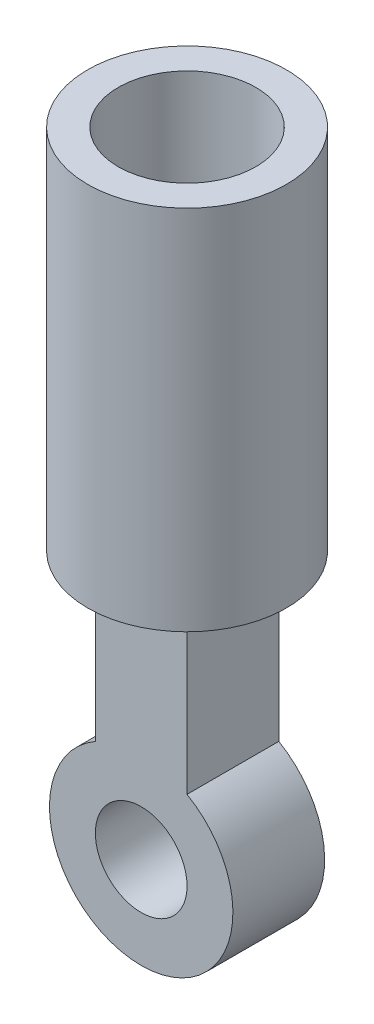
ISO-10303-21;
HEADER;
FILE_DESCRIPTION(('STEP AP214'),'2;1');
FILE_NAME('part.step','',(''),(''),'','','');
FILE_SCHEMA(('AUTOMOTIVE_DESIGN { 1 0 10303 214 1 1 1 1 }'));
ENDSEC;
DATA;
#1=APPLICATION_CONTEXT('core data for automotive mechanical design processes');
#2=APPLICATION_PROTOCOL_DEFINITION('international standard','automotive_design',2000,#1);
#3=PRODUCT_CONTEXT('',#1,'mechanical');
#4=PRODUCT('Part','Part','',(#3));
#5=PRODUCT_RELATED_PRODUCT_CATEGORY('part','',(#4));
#6=PRODUCT_DEFINITION_FORMATION('','',#4);
#7=PRODUCT_DEFINITION_CONTEXT('part definition',#1,'design');
#8=PRODUCT_DEFINITION('design','',#6,#7);
#9=PRODUCT_DEFINITION_SHAPE('','',#8);
#10=(LENGTH_UNIT() NAMED_UNIT(*) SI_UNIT(.MILLI.,.METRE.));
#11=(NAMED_UNIT(*) PLANE_ANGLE_UNIT() SI_UNIT($,.RADIAN.));
#12=(NAMED_UNIT(*) SI_UNIT($,.STERADIAN.) SOLID_ANGLE_UNIT());
#13=UNCERTAINTY_MEASURE_WITH_UNIT(LENGTH_MEASURE(1.E-05),#10,'distance_accuracy_value','');
#14=(GEOMETRIC_REPRESENTATION_CONTEXT(3) GLOBAL_UNCERTAINTY_ASSIGNED_CONTEXT((#13)) GLOBAL_UNIT_ASSIGNED_CONTEXT((#10,
#11,#12)) REPRESENTATION_CONTEXT('',''));
#15=CARTESIAN_POINT('',(0.,0.,0.));
#16=DIRECTION('',(0.,0.,1.));
#17=DIRECTION('',(1.,0.,0.));
#18=AXIS2_PLACEMENT_3D('',#15,#16,#17);
#19=CARTESIAN_POINT('',(0.,0.,3.));
#20=DIRECTION('',(0.,0.,1.));
#21=DIRECTION('',(1.,0.,0.));
#22=AXIS2_PLACEMENT_3D('',#19,#20,#21);
#23=PLANE('',#22);
#24=CARTESIAN_POINT('',(0.,0.,3.));
#25=DIRECTION('',(0.,0.,1.));
#26=DIRECTION('',(1.,0.,0.));
#27=AXIS2_PLACEMENT_3D('',#24,#25,#26);
#28=CIRCLE('',#27,1.5);
#29=CARTESIAN_POINT('',(1.5,0.,3.));
#30=VERTEX_POINT('',#29);
#31=EDGE_CURVE('E152',#30,#30,#28,.T.);
#32=ORIENTED_EDGE('',*,*,#31,.F.);
#33=EDGE_LOOP('',(#32));
#34=FACE_BOUND('',#33,.T.);
#35=DIRECTION('',(0.,1.,0.));
#36=VECTOR('',#35,1.);
#37=CARTESIAN_POINT('',(1.5,10.,3.));
#38=LINE('',#37,#36);
#39=CARTESIAN_POINT('',(1.5,2.59807621135332,3.));
#40=VERTEX_POINT('',#39);
#41=CARTESIAN_POINT('',(1.5,8.,3.));
#42=VERTEX_POINT('',#41);
#43=EDGE_CURVE('E158',#40,#42,#38,.T.);
#44=ORIENTED_EDGE('',*,*,#43,.T.);
#45=DIRECTION('',(-1.,0.,0.));
#46=VECTOR('',#45,1.);
#47=CARTESIAN_POINT('',(0.,8.,3.));
#48=LINE('',#47,#46);
#49=CARTESIAN_POINT('',(-1.5,8.,3.));
#50=VERTEX_POINT('',#49);
#51=EDGE_CURVE('E147',#42,#50,#48,.T.);
#52=ORIENTED_EDGE('',*,*,#51,.T.);
#53=DIRECTION('',(0.,-1.,0.));
#54=VECTOR('',#53,1.);
#55=CARTESIAN_POINT('',(-1.5,10.,3.));
#56=LINE('',#55,#54);
#57=CARTESIAN_POINT('',(-1.5,2.59807621135332,3.));
#58=VERTEX_POINT('',#57);
#59=EDGE_CURVE('E160',#50,#58,#56,.T.);
#60=ORIENTED_EDGE('',*,*,#59,.T.);
#61=CARTESIAN_POINT('',(0.,0.,3.));
#62=DIRECTION('',(0.,0.,1.));
#63=DIRECTION('',(1.,0.,0.));
#64=AXIS2_PLACEMENT_3D('',#61,#62,#63);
#65=CIRCLE('',#64,3.);
#66=EDGE_CURVE('E163',#58,#40,#65,.T.);
#67=ORIENTED_EDGE('',*,*,#66,.T.);
#68=EDGE_LOOP('',(#44,#52,#60,#67));
#69=FACE_BOUND('',#68,.T.);
#70=ADVANCED_FACE('F33',(#34,#69),#23,.T.);
#71=CARTESIAN_POINT('',(0.,0.,0.));
#72=DIRECTION('',(0.,0.,1.));
#73=DIRECTION('',(1.,0.,0.));
#74=AXIS2_PLACEMENT_3D('',#71,#72,#73);
#75=PLANE('',#74);
#76=CARTESIAN_POINT('',(0.,0.,0.));
#77=DIRECTION('',(0.,0.,1.));
#78=DIRECTION('',(1.,0.,0.));
#79=AXIS2_PLACEMENT_3D('',#76,#77,#78);
#80=CIRCLE('',#79,1.5);
#81=CARTESIAN_POINT('',(1.5,0.,0.));
#82=VERTEX_POINT('',#81);
#83=EDGE_CURVE('E151',#82,#82,#80,.T.);
#84=ORIENTED_EDGE('',*,*,#83,.T.);
#85=EDGE_LOOP('',(#84));
#86=FACE_BOUND('',#85,.T.);
#87=DIRECTION('',(-1.,0.,0.));
#88=VECTOR('',#87,1.);
#89=CARTESIAN_POINT('',(0.,8.,0.));
#90=LINE('',#89,#88);
#91=CARTESIAN_POINT('',(1.5,8.,0.));
#92=VERTEX_POINT('',#91);
#93=CARTESIAN_POINT('',(-1.5,8.,0.));
#94=VERTEX_POINT('',#93);
#95=EDGE_CURVE('E56',#92,#94,#90,.T.);
#96=ORIENTED_EDGE('',*,*,#95,.F.);
#97=DIRECTION('',(0.,1.,0.));
#98=VECTOR('',#97,1.);
#99=CARTESIAN_POINT('',(1.5,10.,0.));
#100=LINE('',#99,#98);
#101=CARTESIAN_POINT('',(1.5,2.59807621135332,0.));
#102=VERTEX_POINT('',#101);
#103=EDGE_CURVE('E155',#102,#92,#100,.T.);
#104=ORIENTED_EDGE('',*,*,#103,.F.);
#105=CARTESIAN_POINT('',(0.,0.,0.));
#106=DIRECTION('',(0.,0.,1.));
#107=DIRECTION('',(1.,0.,0.));
#108=AXIS2_PLACEMENT_3D('',#105,#106,#107);
#109=CIRCLE('',#108,3.);
#110=CARTESIAN_POINT('',(-1.5,2.59807621135332,0.));
#111=VERTEX_POINT('',#110);
#112=EDGE_CURVE('E161',#111,#102,#109,.T.);
#113=ORIENTED_EDGE('',*,*,#112,.F.);
#114=DIRECTION('',(0.,-1.,0.));
#115=VECTOR('',#114,1.);
#116=CARTESIAN_POINT('',(-1.5,10.,0.));
#117=LINE('',#116,#115);
#118=EDGE_CURVE('E167',#94,#111,#117,.T.);
#119=ORIENTED_EDGE('',*,*,#118,.F.);
#120=EDGE_LOOP('',(#96,#104,#113,#119));
#121=FACE_BOUND('',#120,.T.);
#122=ADVANCED_FACE('F179',(#86,#121),#75,.F.);
#123=CARTESIAN_POINT('',(1.5,10.,3.));
#124=DIRECTION('',(-1.,0.,0.));
#125=DIRECTION('',(0.,-1.,0.));
#126=AXIS2_PLACEMENT_3D('',#123,#124,#125);
#127=PLANE('',#126);
#128=DIRECTION('',(0.,0.,-1.));
#129=VECTOR('',#128,1.);
#130=CARTESIAN_POINT('',(1.5,8.,3.));
#131=LINE('',#130,#129);
#132=EDGE_CURVE('E48',#42,#92,#131,.T.);
#133=ORIENTED_EDGE('',*,*,#132,.F.);
#134=ORIENTED_EDGE('',*,*,#43,.F.);
#135=DIRECTION('',(0.,0.,-1.));
#136=VECTOR('',#135,1.);
#137=CARTESIAN_POINT('',(1.5,2.59807621135332,3.));
#138=LINE('',#137,#136);
#139=EDGE_CURVE('E165',#40,#102,#138,.T.);
#140=ORIENTED_EDGE('',*,*,#139,.T.);
#141=ORIENTED_EDGE('',*,*,#103,.T.);
#142=EDGE_LOOP('',(#133,#134,#140,#141));
#143=FACE_BOUND('',#142,.T.);
#144=ADVANCED_FACE('F35',(#143),#127,.F.);
#145=CARTESIAN_POINT('',(-1.5,10.,3.));
#146=DIRECTION('',(1.,0.,0.));
#147=DIRECTION('',(0.,1.,0.));
#148=AXIS2_PLACEMENT_3D('',#145,#146,#147);
#149=PLANE('',#148);
#150=DIRECTION('',(0.,0.,1.));
#151=VECTOR('',#150,1.);
#152=CARTESIAN_POINT('',(-1.5,8.,3.));
#153=LINE('',#152,#151);
#154=EDGE_CURVE('E11',#94,#50,#153,.T.);
#155=ORIENTED_EDGE('',*,*,#154,.F.);
#156=ORIENTED_EDGE('',*,*,#118,.T.);
#157=DIRECTION('',(0.,0.,-1.));
#158=VECTOR('',#157,1.);
#159=CARTESIAN_POINT('',(-1.5,2.59807621135332,3.));
#160=LINE('',#159,#158);
#161=EDGE_CURVE('E41',#58,#111,#160,.T.);
#162=ORIENTED_EDGE('',*,*,#161,.F.);
#163=ORIENTED_EDGE('',*,*,#59,.F.);
#164=EDGE_LOOP('',(#155,#156,#162,#163));
#165=FACE_BOUND('',#164,.T.);
#166=ADVANCED_FACE('F184',(#165),#149,.F.);
#167=CARTESIAN_POINT('',(0.,0.,3.));
#168=DIRECTION('',(0.,0.,-1.));
#169=DIRECTION('',(-1.,0.,0.));
#170=AXIS2_PLACEMENT_3D('',#167,#168,#169);
#171=CYLINDRICAL_SURFACE('',#170,3.);
#172=ORIENTED_EDGE('',*,*,#112,.T.);
#173=ORIENTED_EDGE('',*,*,#139,.F.);
#174=ORIENTED_EDGE('',*,*,#66,.F.);
#175=ORIENTED_EDGE('',*,*,#161,.T.);
#176=EDGE_LOOP('',(#172,#173,#174,#175));
#177=FACE_BOUND('',#176,.T.);
#178=ADVANCED_FACE('F176',(#177),#171,.T.);
#179=CARTESIAN_POINT('',(0.,0.,3.));
#180=DIRECTION('',(0.,0.,-1.));
#181=DIRECTION('',(-1.,0.,0.));
#182=AXIS2_PLACEMENT_3D('',#179,#180,#181);
#183=CYLINDRICAL_SURFACE('',#182,1.5);
#184=ORIENTED_EDGE('',*,*,#31,.T.);
#185=EDGE_LOOP('',(#184));
#186=FACE_BOUND('',#185,.T.);
#187=ORIENTED_EDGE('',*,*,#83,.F.);
#188=EDGE_LOOP('',(#187));
#189=FACE_BOUND('',#188,.T.);
#190=ADVANCED_FACE('F190',(#186,#189),#183,.F.);
#191=CARTESIAN_POINT('',(0.,8.,1.5));
#192=DIRECTION('',(0.,1.,0.));
#193=DIRECTION('',(0.,0.,1.));
#194=AXIS2_PLACEMENT_3D('',#191,#192,#193);
#195=PLANE('',#194);
#196=CARTESIAN_POINT('',(0.,8.,1.5));
#197=DIRECTION('',(0.,1.,0.));
#198=DIRECTION('',(0.,0.,1.));
#199=AXIS2_PLACEMENT_3D('',#196,#197,#198);
#200=CIRCLE('',#199,3.25);
#201=CARTESIAN_POINT('',(0.,8.,4.75));
#202=VERTEX_POINT('',#201);
#203=EDGE_CURVE('E143',#202,#202,#200,.T.);
#204=ORIENTED_EDGE('',*,*,#203,.F.);
#205=EDGE_LOOP('',(#204));
#206=FACE_BOUND('',#205,.T.);
#207=ORIENTED_EDGE('',*,*,#51,.F.);
#208=ORIENTED_EDGE('',*,*,#132,.T.);
#209=ORIENTED_EDGE('',*,*,#95,.T.);
#210=ORIENTED_EDGE('',*,*,#154,.T.);
#211=EDGE_LOOP('',(#207,#208,#209,#210));
#212=FACE_BOUND('',#211,.T.);
#213=ADVANCED_FACE('F182',(#206,#212),#195,.F.);
#214=CARTESIAN_POINT('',(0.,8.,1.5));
#215=DIRECTION('',(0.,1.,0.));
#216=DIRECTION('',(0.,0.,1.));
#217=AXIS2_PLACEMENT_3D('',#214,#215,#216);
#218=CYLINDRICAL_SURFACE('',#217,3.25);
#219=ORIENTED_EDGE('',*,*,#203,.T.);
#220=EDGE_LOOP('',(#219));
#221=FACE_BOUND('',#220,.T.);
#222=CARTESIAN_POINT('',(0.,20.,1.5));
#223=DIRECTION('',(0.,1.,0.));
#224=DIRECTION('',(0.,0.,1.));
#225=AXIS2_PLACEMENT_3D('',#222,#223,#224);
#226=CIRCLE('',#225,3.25);
#227=CARTESIAN_POINT('',(0.,20.,4.75));
#228=VERTEX_POINT('',#227);
#229=EDGE_CURVE('E140',#228,#228,#226,.T.);
#230=ORIENTED_EDGE('',*,*,#229,.F.);
#231=EDGE_LOOP('',(#230));
#232=FACE_BOUND('',#231,.T.);
#233=ADVANCED_FACE('F205',(#221,#232),#218,.T.);
#234=CARTESIAN_POINT('',(0.,20.,1.5));
#235=DIRECTION('',(0.,1.,0.));
#236=DIRECTION('',(0.,0.,1.));
#237=AXIS2_PLACEMENT_3D('',#234,#235,#236);
#238=PLANE('',#237);
#239=CARTESIAN_POINT('',(0.,20.,1.5));
#240=DIRECTION('',(0.,1.,0.));
#241=DIRECTION('',(0.,0.,1.));
#242=AXIS2_PLACEMENT_3D('',#239,#240,#241);
#243=CIRCLE('',#242,2.25);
#244=CARTESIAN_POINT('',(0.,20.,3.75));
#245=VERTEX_POINT('',#244);
#246=EDGE_CURVE('E136',#245,#245,#243,.T.);
#247=ORIENTED_EDGE('',*,*,#246,.F.);
#248=EDGE_LOOP('',(#247));
#249=FACE_BOUND('',#248,.T.);
#250=ORIENTED_EDGE('',*,*,#229,.T.);
#251=EDGE_LOOP('',(#250));
#252=FACE_BOUND('',#251,.T.);
#253=ADVANCED_FACE('F208',(#249,#252),#238,.T.);
#254=CARTESIAN_POINT('',(0.,0.,2.));
#255=DIRECTION('',(0.,0.,1.));
#256=DIRECTION('',(1.,0.,0.));
#257=AXIS2_PLACEMENT_3D('',#254,#255,#256);
#258=PLANE('',#257);
#259=CARTESIAN_POINT('',(0.,0.,2.));
#260=DIRECTION('',(0.,0.,1.));
#261=DIRECTION('',(1.,0.,0.));
#262=AXIS2_PLACEMENT_3D('',#259,#260,#261);
#263=CIRCLE('',#262,2.5);
#264=CARTESIAN_POINT('',(0.499999999999999,2.44948974278318,2.));
#265=VERTEX_POINT('',#264);
#266=CARTESIAN_POINT('',(-0.499999999999999,2.44948974278318,2.));
#267=VERTEX_POINT('',#266);
#268=EDGE_CURVE('E108',#265,#267,#263,.T.);
#269=ORIENTED_EDGE('',*,*,#268,.T.);
#270=DIRECTION('',(0.,-1.,0.));
#271=VECTOR('',#270,1.);
#272=CARTESIAN_POINT('',(-0.5,10.,2.));
#273=LINE('',#272,#271);
#274=CARTESIAN_POINT('',(-0.5,9.,2.));
#275=VERTEX_POINT('',#274);
#276=EDGE_CURVE('E102',#275,#267,#273,.T.);
#277=ORIENTED_EDGE('',*,*,#276,.F.);
#278=DIRECTION('',(-1.,0.,0.));
#279=VECTOR('',#278,1.);
#280=CARTESIAN_POINT('',(0.,9.,2.));
#281=LINE('',#280,#279);
#282=CARTESIAN_POINT('',(0.5,9.,2.));
#283=VERTEX_POINT('',#282);
#284=EDGE_CURVE('E106',#283,#275,#281,.T.);
#285=ORIENTED_EDGE('',*,*,#284,.F.);
#286=DIRECTION('',(0.,1.,0.));
#287=VECTOR('',#286,1.);
#288=CARTESIAN_POINT('',(0.5,10.,2.));
#289=LINE('',#288,#287);
#290=EDGE_CURVE('E112',#265,#283,#289,.T.);
#291=ORIENTED_EDGE('',*,*,#290,.F.);
#292=EDGE_LOOP('',(#269,#277,#285,#291));
#293=FACE_BOUND('',#292,.T.);
#294=ADVANCED_FACE('F104',(#293),#258,.F.);
#295=CARTESIAN_POINT('',(0.,0.,1.));
#296=DIRECTION('',(0.,0.,1.));
#297=DIRECTION('',(1.,0.,0.));
#298=AXIS2_PLACEMENT_3D('',#295,#296,#297);
#299=PLANE('',#298);
#300=DIRECTION('',(0.,1.,0.));
#301=VECTOR('',#300,1.);
#302=CARTESIAN_POINT('',(0.5,10.,1.));
#303=LINE('',#302,#301);
#304=CARTESIAN_POINT('',(0.499999999999999,2.44948974278318,1.));
#305=VERTEX_POINT('',#304);
#306=CARTESIAN_POINT('',(0.5,9.,1.));
#307=VERTEX_POINT('',#306);
#308=EDGE_CURVE('E333',#305,#307,#303,.T.);
#309=ORIENTED_EDGE('',*,*,#308,.T.);
#310=DIRECTION('',(-1.,0.,0.));
#311=VECTOR('',#310,1.);
#312=CARTESIAN_POINT('',(0.,9.,1.));
#313=LINE('',#312,#311);
#314=CARTESIAN_POINT('',(-0.5,9.,1.));
#315=VERTEX_POINT('',#314);
#316=EDGE_CURVE('E121',#307,#315,#313,.T.);
#317=ORIENTED_EDGE('',*,*,#316,.T.);
#318=DIRECTION('',(0.,-1.,0.));
#319=VECTOR('',#318,1.);
#320=CARTESIAN_POINT('',(-0.5,10.,1.));
#321=LINE('',#320,#319);
#322=CARTESIAN_POINT('',(-0.499999999999999,2.44948974278318,1.));
#323=VERTEX_POINT('',#322);
#324=EDGE_CURVE('E125',#315,#323,#321,.T.);
#325=ORIENTED_EDGE('',*,*,#324,.T.);
#326=CARTESIAN_POINT('',(0.,0.,1.));
#327=DIRECTION('',(0.,0.,1.));
#328=DIRECTION('',(1.,0.,0.));
#329=AXIS2_PLACEMENT_3D('',#326,#327,#328);
#330=CIRCLE('',#329,2.5);
#331=EDGE_CURVE('E335',#305,#323,#330,.T.);
#332=ORIENTED_EDGE('',*,*,#331,.F.);
#333=EDGE_LOOP('',(#309,#317,#325,#332));
#334=FACE_BOUND('',#333,.T.);
#335=ADVANCED_FACE('F232',(#334),#299,.T.);
#336=CARTESIAN_POINT('',(0.5,10.,3.));
#337=DIRECTION('',(-1.,0.,0.));
#338=DIRECTION('',(0.,-1.,0.));
#339=AXIS2_PLACEMENT_3D('',#336,#337,#338);
#340=PLANE('',#339);
#341=ORIENTED_EDGE('',*,*,#290,.T.);
#342=DIRECTION('',(0.,0.,-1.));
#343=VECTOR('',#342,1.);
#344=CARTESIAN_POINT('',(0.5,9.,3.));
#345=LINE('',#344,#343);
#346=EDGE_CURVE('E120',#283,#307,#345,.T.);
#347=ORIENTED_EDGE('',*,*,#346,.T.);
#348=ORIENTED_EDGE('',*,*,#308,.F.);
#349=DIRECTION('',(0.,0.,-1.));
#350=VECTOR('',#349,1.);
#351=CARTESIAN_POINT('',(0.499999999999999,2.44948974278318,3.));
#352=LINE('',#351,#350);
#353=EDGE_CURVE('E126',#265,#305,#352,.T.);
#354=ORIENTED_EDGE('',*,*,#353,.F.);
#355=EDGE_LOOP('',(#341,#347,#348,#354));
#356=FACE_BOUND('',#355,.T.);
#357=ADVANCED_FACE('F229',(#356),#340,.T.);
#358=CARTESIAN_POINT('',(-0.5,10.,3.));
#359=DIRECTION('',(1.,0.,0.));
#360=DIRECTION('',(0.,1.,0.));
#361=AXIS2_PLACEMENT_3D('',#358,#359,#360);
#362=PLANE('',#361);
#363=DIRECTION('',(0.,0.,-1.));
#364=VECTOR('',#363,1.);
#365=CARTESIAN_POINT('',(-0.499999999999999,2.44948974278318,3.));
#366=LINE('',#365,#364);
#367=EDGE_CURVE('E128',#267,#323,#366,.T.);
#368=ORIENTED_EDGE('',*,*,#367,.T.);
#369=ORIENTED_EDGE('',*,*,#324,.F.);
#370=DIRECTION('',(0.,0.,1.));
#371=VECTOR('',#370,1.);
#372=CARTESIAN_POINT('',(-0.5,9.,3.));
#373=LINE('',#372,#371);
#374=EDGE_CURVE('E111',#315,#275,#373,.T.);
#375=ORIENTED_EDGE('',*,*,#374,.T.);
#376=ORIENTED_EDGE('',*,*,#276,.T.);
#377=EDGE_LOOP('',(#368,#369,#375,#376));
#378=FACE_BOUND('',#377,.T.);
#379=ADVANCED_FACE('F123',(#378),#362,.T.);
#380=CARTESIAN_POINT('',(0.,0.,3.));
#381=DIRECTION('',(0.,0.,-1.));
#382=DIRECTION('',(-1.,0.,0.));
#383=AXIS2_PLACEMENT_3D('',#380,#381,#382);
#384=CYLINDRICAL_SURFACE('',#383,2.5);
#385=ORIENTED_EDGE('',*,*,#268,.F.);
#386=ORIENTED_EDGE('',*,*,#353,.T.);
#387=ORIENTED_EDGE('',*,*,#331,.T.);
#388=ORIENTED_EDGE('',*,*,#367,.F.);
#389=EDGE_LOOP('',(#385,#386,#387,#388));
#390=FACE_BOUND('',#389,.T.);
#391=ADVANCED_FACE('F222',(#390),#384,.T.);
#392=CARTESIAN_POINT('',(0.,9.,1.5));
#393=DIRECTION('',(0.,1.,0.));
#394=DIRECTION('',(0.,0.,1.));
#395=AXIS2_PLACEMENT_3D('',#392,#393,#394);
#396=PLANE('',#395);
#397=CARTESIAN_POINT('',(0.,9.,1.5));
#398=DIRECTION('',(0.,1.,0.));
#399=DIRECTION('',(0.,0.,1.));
#400=AXIS2_PLACEMENT_3D('',#397,#398,#399);
#401=CIRCLE('',#400,2.25);
#402=CARTESIAN_POINT('',(0.,9.,3.75));
#403=VERTEX_POINT('',#402);
#404=EDGE_CURVE('E133',#403,#403,#401,.T.);
#405=ORIENTED_EDGE('',*,*,#404,.T.);
#406=EDGE_LOOP('',(#405));
#407=FACE_BOUND('',#406,.T.);
#408=ORIENTED_EDGE('',*,*,#284,.T.);
#409=ORIENTED_EDGE('',*,*,#374,.F.);
#410=ORIENTED_EDGE('',*,*,#316,.F.);
#411=ORIENTED_EDGE('',*,*,#346,.F.);
#412=EDGE_LOOP('',(#408,#409,#410,#411));
#413=FACE_BOUND('',#412,.T.);
#414=ADVANCED_FACE('F117',(#407,#413),#396,.T.);
#415=CARTESIAN_POINT('',(0.,8.,1.5));
#416=DIRECTION('',(0.,1.,0.));
#417=DIRECTION('',(0.,0.,1.));
#418=AXIS2_PLACEMENT_3D('',#415,#416,#417);
#419=CYLINDRICAL_SURFACE('',#418,2.25);
#420=ORIENTED_EDGE('',*,*,#404,.F.);
#421=EDGE_LOOP('',(#420));
#422=FACE_BOUND('',#421,.T.);
#423=ORIENTED_EDGE('',*,*,#246,.T.);
#424=EDGE_LOOP('',(#423));
#425=FACE_BOUND('',#424,.T.);
#426=ADVANCED_FACE('F216',(#422,#425),#419,.F.);
#427=CLOSED_SHELL('',(#70,#122,#144,#166,#178,#190,#213,#233,#253,#294,#335,#357,#379,#391,#414,#426));
#428=MANIFOLD_SOLID_BREP('B2',#427);
#429=ADVANCED_BREP_SHAPE_REPRESENTATION('',(#18,#428),#14);
#430=SHAPE_DEFINITION_REPRESENTATION(#9,#429);
ENDSEC;
END-ISO-10303-21;
